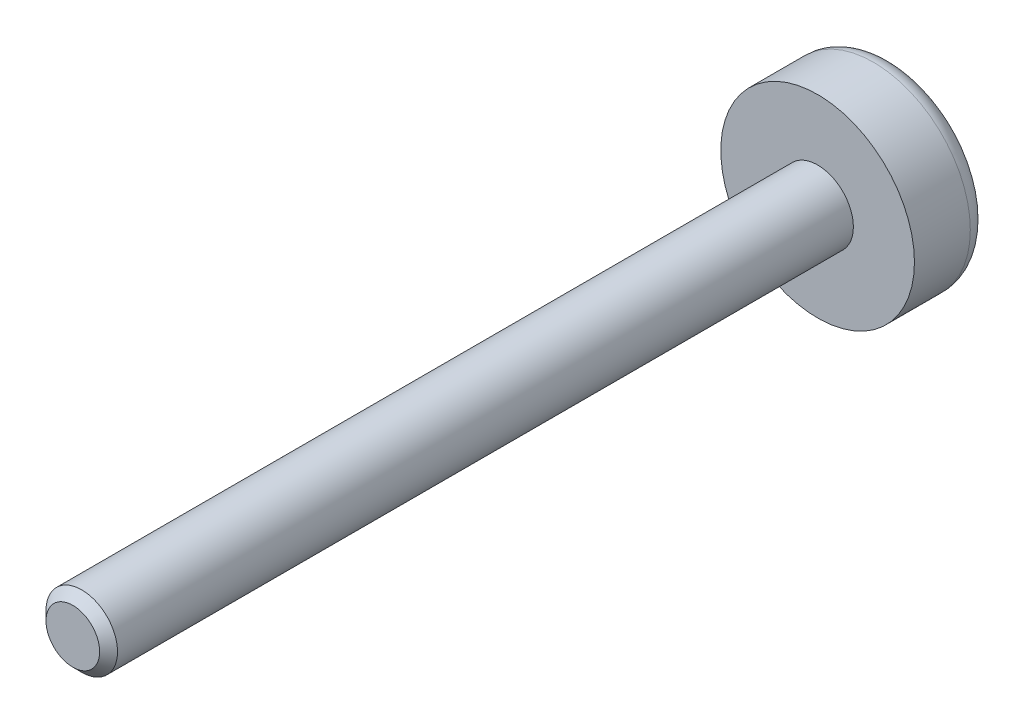
ISO-10303-21;
HEADER;
FILE_DESCRIPTION(('STEP AP214'),'2;1');
FILE_NAME('part.step','',(''),(''),'','','');
FILE_SCHEMA(('AUTOMOTIVE_DESIGN { 1 0 10303 214 1 1 1 1 }'));
ENDSEC;
DATA;
#1=APPLICATION_CONTEXT('core data for automotive mechanical design processes');
#2=APPLICATION_PROTOCOL_DEFINITION('international standard','automotive_design',2000,#1);
#3=PRODUCT_CONTEXT('',#1,'mechanical');
#4=PRODUCT('Part','Part','',(#3));
#5=PRODUCT_RELATED_PRODUCT_CATEGORY('part','',(#4));
#6=PRODUCT_DEFINITION_FORMATION('','',#4);
#7=PRODUCT_DEFINITION_CONTEXT('part definition',#1,'design');
#8=PRODUCT_DEFINITION('design','',#6,#7);
#9=PRODUCT_DEFINITION_SHAPE('','',#8);
#10=(LENGTH_UNIT() NAMED_UNIT(*) SI_UNIT(.MILLI.,.METRE.));
#11=(NAMED_UNIT(*) PLANE_ANGLE_UNIT() SI_UNIT($,.RADIAN.));
#12=(NAMED_UNIT(*) SI_UNIT($,.STERADIAN.) SOLID_ANGLE_UNIT());
#13=UNCERTAINTY_MEASURE_WITH_UNIT(LENGTH_MEASURE(1.E-05),#10,'distance_accuracy_value','');
#14=(GEOMETRIC_REPRESENTATION_CONTEXT(3) GLOBAL_UNCERTAINTY_ASSIGNED_CONTEXT((#13)) GLOBAL_UNIT_ASSIGNED_CONTEXT((#10,
#11,#12)) REPRESENTATION_CONTEXT('',''));
#15=CARTESIAN_POINT('',(0.,0.,0.));
#16=DIRECTION('',(0.,0.,1.));
#17=DIRECTION('',(1.,0.,0.));
#18=AXIS2_PLACEMENT_3D('',#15,#16,#17);
#19=CARTESIAN_POINT('',(0.,0.,25.));
#20=DIRECTION('',(0.,0.,1.));
#21=DIRECTION('',(-1.,0.,0.));
#22=AXIS2_PLACEMENT_3D('',#19,#20,#21);
#23=PLANE('',#22);
#24=CARTESIAN_POINT('',(0.,0.,25.));
#25=DIRECTION('',(0.,0.,-1.));
#26=DIRECTION('',(-1.,0.,0.));
#27=AXIS2_PLACEMENT_3D('',#24,#25,#26);
#28=CIRCLE('',#27,0.900000000000008);
#29=CARTESIAN_POINT('',(-0.900000000000008,0.,25.));
#30=VERTEX_POINT('',#29);
#31=EDGE_CURVE('E140',#30,#30,#28,.T.);
#32=ORIENTED_EDGE('',*,*,#31,.F.);
#33=EDGE_LOOP('',(#32));
#34=FACE_BOUND('',#33,.T.);
#35=ADVANCED_FACE('F41',(#34),#23,.T.);
#36=CARTESIAN_POINT('',(0.,0.,-10.123));
#37=DIRECTION('',(0.,0.,-1.));
#38=DIRECTION('',(1.,0.,0.));
#39=AXIS2_PLACEMENT_3D('',#36,#37,#38);
#40=CYLINDRICAL_SURFACE('',#39,1.2);
#41=CARTESIAN_POINT('',(0.,0.,24.7));
#42=DIRECTION('',(0.,0.,-1.));
#43=DIRECTION('',(-1.,0.,0.));
#44=AXIS2_PLACEMENT_3D('',#41,#42,#43);
#45=CIRCLE('',#44,1.2);
#46=CARTESIAN_POINT('',(-1.2,0.,24.7));
#47=VERTEX_POINT('',#46);
#48=EDGE_CURVE('E137',#47,#47,#45,.F.);
#49=ORIENTED_EDGE('',*,*,#48,.F.);
#50=EDGE_LOOP('',(#49));
#51=FACE_BOUND('',#50,.T.);
#52=CARTESIAN_POINT('',(0.,0.,0.));
#53=DIRECTION('',(0.,0.,1.));
#54=DIRECTION('',(1.,0.,0.));
#55=AXIS2_PLACEMENT_3D('',#52,#53,#54);
#56=CIRCLE('',#55,1.2);
#57=CARTESIAN_POINT('',(1.2,0.,0.));
#58=VERTEX_POINT('',#57);
#59=EDGE_CURVE('E134',#58,#58,#56,.T.);
#60=ORIENTED_EDGE('',*,*,#59,.T.);
#61=EDGE_LOOP('',(#60));
#62=FACE_BOUND('',#61,.T.);
#63=ADVANCED_FACE('F163',(#51,#62),#40,.T.);
#64=CARTESIAN_POINT('',(1.2,0.,0.));
#65=DIRECTION('',(0.,0.,1.));
#66=DIRECTION('',(-1.,0.,0.));
#67=AXIS2_PLACEMENT_3D('',#64,#65,#66);
#68=PLANE('',#67);
#69=ORIENTED_EDGE('',*,*,#59,.F.);
#70=EDGE_LOOP('',(#69));
#71=FACE_BOUND('',#70,.T.);
#72=CARTESIAN_POINT('',(0.,0.,0.));
#73=DIRECTION('',(0.,0.,1.));
#74=DIRECTION('',(1.,0.,0.));
#75=AXIS2_PLACEMENT_3D('',#72,#73,#74);
#76=CIRCLE('',#75,3.25);
#77=CARTESIAN_POINT('',(3.25,0.,0.));
#78=VERTEX_POINT('',#77);
#79=EDGE_CURVE('E131',#78,#78,#76,.T.);
#80=ORIENTED_EDGE('',*,*,#79,.T.);
#81=EDGE_LOOP('',(#80));
#82=FACE_BOUND('',#81,.T.);
#83=ADVANCED_FACE('F157',(#71,#82),#68,.T.);
#84=CARTESIAN_POINT('',(0.,0.,-10.123));
#85=DIRECTION('',(0.,0.,-1.));
#86=DIRECTION('',(1.,0.,0.));
#87=AXIS2_PLACEMENT_3D('',#84,#85,#86);
#88=CYLINDRICAL_SURFACE('',#87,3.25);
#89=CARTESIAN_POINT('',(0.,0.,-1.875));
#90=DIRECTION('',(0.,0.,1.));
#91=DIRECTION('',(1.,0.,0.));
#92=AXIS2_PLACEMENT_3D('',#89,#90,#91);
#93=CIRCLE('',#92,3.25);
#94=CARTESIAN_POINT('',(3.25,0.,-1.875));
#95=VERTEX_POINT('',#94);
#96=EDGE_CURVE('E11',#95,#95,#93,.F.);
#97=ORIENTED_EDGE('',*,*,#96,.F.);
#98=EDGE_LOOP('',(#97));
#99=FACE_BOUND('',#98,.T.);
#100=ORIENTED_EDGE('',*,*,#79,.F.);
#101=EDGE_LOOP('',(#100));
#102=FACE_BOUND('',#101,.T.);
#103=ADVANCED_FACE('F149',(#99,#102),#88,.T.);
#104=CARTESIAN_POINT('',(3.25,0.,-2.5));
#105=DIRECTION('',(0.,0.,-1.));
#106=DIRECTION('',(1.,0.,0.));
#107=AXIS2_PLACEMENT_3D('',#104,#105,#106);
#108=PLANE('',#107);
#109=DIRECTION('',(0.499999999999995,0.866025403784441,0.));
#110=VECTOR('',#109,1.);
#111=CARTESIAN_POINT('',(0.577350269189637,-0.999999999999993,-2.5));
#112=LINE('',#111,#110);
#113=CARTESIAN_POINT('',(0.577350269189637,-0.999999999999993,-2.5));
#114=VERTEX_POINT('',#113);
#115=CARTESIAN_POINT('',(1.15470053837925,0.,-2.5));
#116=VERTEX_POINT('',#115);
#117=EDGE_CURVE('E315',#114,#116,#112,.T.);
#118=ORIENTED_EDGE('',*,*,#117,.T.);
#119=DIRECTION('',(-0.500000000000001,0.866025403784438,0.));
#120=VECTOR('',#119,1.);
#121=CARTESIAN_POINT('',(1.15470053837925,0.,-2.5));
#122=LINE('',#121,#120);
#123=CARTESIAN_POINT('',(0.577350269189624,1.,-2.5));
#124=VERTEX_POINT('',#123);
#125=EDGE_CURVE('E310',#116,#124,#122,.T.);
#126=ORIENTED_EDGE('',*,*,#125,.T.);
#127=DIRECTION('',(-1.,0.,0.));
#128=VECTOR('',#127,1.);
#129=CARTESIAN_POINT('',(0.577350269189624,1.,-2.5));
#130=LINE('',#129,#128);
#131=CARTESIAN_POINT('',(-0.57735026918963,0.999999999999998,-2.5));
#132=VERTEX_POINT('',#131);
#133=EDGE_CURVE('E314',#124,#132,#130,.T.);
#134=ORIENTED_EDGE('',*,*,#133,.T.);
#135=DIRECTION('',(-0.499999999999995,-0.866025403784442,0.));
#136=VECTOR('',#135,1.);
#137=CARTESIAN_POINT('',(-0.57735026918963,0.999999999999998,-2.5));
#138=LINE('',#137,#136);
#139=CARTESIAN_POINT('',(-1.15470053837925,0.,-2.5));
#140=VERTEX_POINT('',#139);
#141=EDGE_CURVE('E322',#132,#140,#138,.T.);
#142=ORIENTED_EDGE('',*,*,#141,.T.);
#143=DIRECTION('',(0.500000000000007,-0.866025403784434,0.));
#144=VECTOR('',#143,1.);
#145=CARTESIAN_POINT('',(-1.15470053837925,0.,-2.5));
#146=LINE('',#145,#144);
#147=CARTESIAN_POINT('',(-0.577350269189617,-1.00000000000001,-2.5));
#148=VERTEX_POINT('',#147);
#149=EDGE_CURVE('E120',#140,#148,#146,.T.);
#150=ORIENTED_EDGE('',*,*,#149,.T.);
#151=DIRECTION('',(1.,0.,0.));
#152=VECTOR('',#151,1.);
#153=CARTESIAN_POINT('',(-0.577350269189617,-1.00000000000001,-2.5));
#154=LINE('',#153,#152);
#155=EDGE_CURVE('E317',#148,#114,#154,.T.);
#156=ORIENTED_EDGE('',*,*,#155,.T.);
#157=EDGE_LOOP('',(#118,#126,#134,#142,#150,#156));
#158=FACE_BOUND('',#157,.T.);
#159=CARTESIAN_POINT('',(0.,0.,-2.5));
#160=DIRECTION('',(0.,0.,1.));
#161=DIRECTION('',(1.,0.,0.));
#162=AXIS2_PLACEMENT_3D('',#159,#160,#161);
#163=CIRCLE('',#162,2.625);
#164=CARTESIAN_POINT('',(2.625,0.,-2.5));
#165=VERTEX_POINT('',#164);
#166=EDGE_CURVE('E49',#165,#165,#163,.T.);
#167=ORIENTED_EDGE('',*,*,#166,.F.);
#168=EDGE_LOOP('',(#167));
#169=FACE_BOUND('',#168,.T.);
#170=ADVANCED_FACE('F146',(#158,#169),#108,.T.);
#171=CARTESIAN_POINT('',(0.,0.,24.7));
#172=DIRECTION('',(0.,0.,-1.));
#173=DIRECTION('',(1.,0.,0.));
#174=AXIS2_PLACEMENT_3D('',#171,#172,#173);
#175=CONICAL_SURFACE('',#174,1.2,0.785398163397443);
#176=ORIENTED_EDGE('',*,*,#31,.T.);
#177=EDGE_LOOP('',(#176));
#178=FACE_BOUND('',#177,.T.);
#179=ORIENTED_EDGE('',*,*,#48,.T.);
#180=EDGE_LOOP('',(#179));
#181=FACE_BOUND('',#180,.T.);
#182=ADVANCED_FACE('F148',(#178,#181),#175,.T.);
#183=CARTESIAN_POINT('',(0.,0.,-1.875));
#184=DIRECTION('',(0.,0.,-1.));
#185=DIRECTION('',(1.,0.,0.));
#186=AXIS2_PLACEMENT_3D('',#183,#184,#185);
#187=TOROIDAL_SURFACE('',#186,2.625,0.625);
#188=ORIENTED_EDGE('',*,*,#96,.T.);
#189=EDGE_LOOP('',(#188));
#190=FACE_BOUND('',#189,.T.);
#191=ORIENTED_EDGE('',*,*,#166,.T.);
#192=EDGE_LOOP('',(#191));
#193=FACE_BOUND('',#192,.T.);
#194=ADVANCED_FACE('F43',(#190,#193),#187,.T.);
#195=CARTESIAN_POINT('',(0.577350269189637,-0.999999999999993,-1.125));
#196=DIRECTION('',(0.866025403784441,-0.499999999999995,0.));
#197=DIRECTION('',(0.499999999999995,0.866025403784441,0.));
#198=AXIS2_PLACEMENT_3D('',#195,#196,#197);
#199=PLANE('',#198);
#200=ORIENTED_EDGE('',*,*,#117,.F.);
#201=DIRECTION('',(0.,0.,-1.));
#202=VECTOR('',#201,1.);
#203=CARTESIAN_POINT('',(0.577350269189637,-0.999999999999993,-1.125));
#204=LINE('',#203,#202);
#205=CARTESIAN_POINT('',(0.577350269189637,-0.999999999999993,-1.125));
#206=VERTEX_POINT('',#205);
#207=EDGE_CURVE('E87',#206,#114,#204,.T.);
#208=ORIENTED_EDGE('',*,*,#207,.F.);
#209=DIRECTION('',(0.499999999999995,0.866025403784441,0.));
#210=VECTOR('',#209,1.);
#211=CARTESIAN_POINT('',(0.577350269189637,-0.999999999999993,-1.125));
#212=LINE('',#211,#210);
#213=CARTESIAN_POINT('',(1.15470053837925,0.,-1.125));
#214=VERTEX_POINT('',#213);
#215=EDGE_CURVE('E325',#206,#214,#212,.T.);
#216=ORIENTED_EDGE('',*,*,#215,.T.);
#217=DIRECTION('',(0.,0.,-1.));
#218=VECTOR('',#217,1.);
#219=CARTESIAN_POINT('',(1.15470053837925,0.,-1.125));
#220=LINE('',#219,#218);
#221=EDGE_CURVE('E56',#214,#116,#220,.T.);
#222=ORIENTED_EDGE('',*,*,#221,.T.);
#223=EDGE_LOOP('',(#200,#208,#216,#222));
#224=FACE_BOUND('',#223,.T.);
#225=ADVANCED_FACE('F210',(#224),#199,.F.);
#226=CARTESIAN_POINT('',(-0.577350269189617,-1.00000000000001,-1.125));
#227=DIRECTION('',(0.,-1.,0.));
#228=DIRECTION('',(1.,0.,0.));
#229=AXIS2_PLACEMENT_3D('',#226,#227,#228);
#230=PLANE('',#229);
#231=ORIENTED_EDGE('',*,*,#155,.F.);
#232=DIRECTION('',(0.,0.,-1.));
#233=VECTOR('',#232,1.);
#234=CARTESIAN_POINT('',(-0.577350269189617,-1.00000000000001,-1.125));
#235=LINE('',#234,#233);
#236=CARTESIAN_POINT('',(-0.577350269189617,-1.00000000000001,-1.125));
#237=VERTEX_POINT('',#236);
#238=EDGE_CURVE('E122',#237,#148,#235,.T.);
#239=ORIENTED_EDGE('',*,*,#238,.F.);
#240=DIRECTION('',(1.,0.,0.));
#241=VECTOR('',#240,1.);
#242=CARTESIAN_POINT('',(-0.577350269189617,-1.00000000000001,-1.125));
#243=LINE('',#242,#241);
#244=EDGE_CURVE('E65',#237,#206,#243,.T.);
#245=ORIENTED_EDGE('',*,*,#244,.T.);
#246=ORIENTED_EDGE('',*,*,#207,.T.);
#247=EDGE_LOOP('',(#231,#239,#245,#246));
#248=FACE_BOUND('',#247,.T.);
#249=ADVANCED_FACE('F220',(#248),#230,.F.);
#250=CARTESIAN_POINT('',(-1.15470053837925,0.,-1.125));
#251=DIRECTION('',(-0.866025403784435,-0.500000000000007,0.));
#252=DIRECTION('',(0.500000000000007,-0.866025403784435,0.));
#253=AXIS2_PLACEMENT_3D('',#250,#251,#252);
#254=PLANE('',#253);
#255=ORIENTED_EDGE('',*,*,#149,.F.);
#256=DIRECTION('',(0.,0.,-1.));
#257=VECTOR('',#256,1.);
#258=CARTESIAN_POINT('',(-1.15470053837925,0.,-1.125));
#259=LINE('',#258,#257);
#260=CARTESIAN_POINT('',(-1.15470053837925,0.,-1.125));
#261=VERTEX_POINT('',#260);
#262=EDGE_CURVE('E109',#261,#140,#259,.T.);
#263=ORIENTED_EDGE('',*,*,#262,.F.);
#264=DIRECTION('',(0.500000000000007,-0.866025403784434,0.));
#265=VECTOR('',#264,1.);
#266=CARTESIAN_POINT('',(-1.15470053837925,0.,-1.125));
#267=LINE('',#266,#265);
#268=EDGE_CURVE('E112',#261,#237,#267,.T.);
#269=ORIENTED_EDGE('',*,*,#268,.T.);
#270=ORIENTED_EDGE('',*,*,#238,.T.);
#271=EDGE_LOOP('',(#255,#263,#269,#270));
#272=FACE_BOUND('',#271,.T.);
#273=ADVANCED_FACE('F118',(#272),#254,.F.);
#274=CARTESIAN_POINT('',(-0.57735026918963,0.999999999999998,-1.125));
#275=DIRECTION('',(-0.866025403784442,0.499999999999995,0.));
#276=DIRECTION('',(-0.499999999999995,-0.866025403784441,0.));
#277=AXIS2_PLACEMENT_3D('',#274,#275,#276);
#278=PLANE('',#277);
#279=ORIENTED_EDGE('',*,*,#141,.F.);
#280=DIRECTION('',(0.,0.,-1.));
#281=VECTOR('',#280,1.);
#282=CARTESIAN_POINT('',(-0.57735026918963,0.999999999999998,-1.125));
#283=LINE('',#282,#281);
#284=CARTESIAN_POINT('',(-0.57735026918963,0.999999999999998,-1.125));
#285=VERTEX_POINT('',#284);
#286=EDGE_CURVE('E111',#285,#132,#283,.T.);
#287=ORIENTED_EDGE('',*,*,#286,.F.);
#288=DIRECTION('',(-0.499999999999995,-0.866025403784442,0.));
#289=VECTOR('',#288,1.);
#290=CARTESIAN_POINT('',(-0.57735026918963,0.999999999999998,-1.125));
#291=LINE('',#290,#289);
#292=EDGE_CURVE('E104',#285,#261,#291,.T.);
#293=ORIENTED_EDGE('',*,*,#292,.T.);
#294=ORIENTED_EDGE('',*,*,#262,.T.);
#295=EDGE_LOOP('',(#279,#287,#293,#294));
#296=FACE_BOUND('',#295,.T.);
#297=ADVANCED_FACE('F107',(#296),#278,.F.);
#298=CARTESIAN_POINT('',(0.577350269189624,1.,-1.125));
#299=DIRECTION('',(0.,1.,0.));
#300=DIRECTION('',(-1.,0.,0.));
#301=AXIS2_PLACEMENT_3D('',#298,#299,#300);
#302=PLANE('',#301);
#303=ORIENTED_EDGE('',*,*,#133,.F.);
#304=DIRECTION('',(0.,0.,-1.));
#305=VECTOR('',#304,1.);
#306=CARTESIAN_POINT('',(0.577350269189624,1.,-1.125));
#307=LINE('',#306,#305);
#308=CARTESIAN_POINT('',(0.577350269189624,1.,-1.125));
#309=VERTEX_POINT('',#308);
#310=EDGE_CURVE('E125',#309,#124,#307,.T.);
#311=ORIENTED_EDGE('',*,*,#310,.F.);
#312=DIRECTION('',(-1.,0.,0.));
#313=VECTOR('',#312,1.);
#314=CARTESIAN_POINT('',(0.577350269189624,1.,-1.125));
#315=LINE('',#314,#313);
#316=EDGE_CURVE('E113',#309,#285,#315,.T.);
#317=ORIENTED_EDGE('',*,*,#316,.T.);
#318=ORIENTED_EDGE('',*,*,#286,.T.);
#319=EDGE_LOOP('',(#303,#311,#317,#318));
#320=FACE_BOUND('',#319,.T.);
#321=ADVANCED_FACE('F247',(#320),#302,.F.);
#322=CARTESIAN_POINT('',(1.15470053837925,0.,-1.125));
#323=DIRECTION('',(0.866025403784438,0.500000000000001,0.));
#324=DIRECTION('',(-0.500000000000001,0.866025403784438,0.));
#325=AXIS2_PLACEMENT_3D('',#322,#323,#324);
#326=PLANE('',#325);
#327=ORIENTED_EDGE('',*,*,#125,.F.);
#328=ORIENTED_EDGE('',*,*,#221,.F.);
#329=DIRECTION('',(-0.500000000000001,0.866025403784438,0.));
#330=VECTOR('',#329,1.);
#331=CARTESIAN_POINT('',(1.15470053837925,0.,-1.125));
#332=LINE('',#331,#330);
#333=EDGE_CURVE('E95',#214,#309,#332,.T.);
#334=ORIENTED_EDGE('',*,*,#333,.T.);
#335=ORIENTED_EDGE('',*,*,#310,.T.);
#336=EDGE_LOOP('',(#327,#328,#334,#335));
#337=FACE_BOUND('',#336,.T.);
#338=ADVANCED_FACE('F257',(#337),#326,.F.);
#339=CARTESIAN_POINT('',(0.,0.,-1.125));
#340=DIRECTION('',(0.,0.,-1.));
#341=DIRECTION('',(1.,0.,0.));
#342=AXIS2_PLACEMENT_3D('',#339,#340,#341);
#343=PLANE('',#342);
#344=ORIENTED_EDGE('',*,*,#215,.F.);
#345=ORIENTED_EDGE('',*,*,#244,.F.);
#346=ORIENTED_EDGE('',*,*,#268,.F.);
#347=ORIENTED_EDGE('',*,*,#292,.F.);
#348=ORIENTED_EDGE('',*,*,#316,.F.);
#349=ORIENTED_EDGE('',*,*,#333,.F.);
#350=EDGE_LOOP('',(#344,#345,#346,#347,#348,#349));
#351=FACE_BOUND('',#350,.T.);
#352=ADVANCED_FACE('F115',(#351),#343,.T.);
#353=CLOSED_SHELL('',(#35,#63,#83,#103,#170,#182,#194,#225,#249,#273,#297,#321,#338,#352));
#354=MANIFOLD_SOLID_BREP('B2',#353);
#355=ADVANCED_BREP_SHAPE_REPRESENTATION('',(#18,#354),#14);
#356=SHAPE_DEFINITION_REPRESENTATION(#9,#355);
ENDSEC;
END-ISO-10303-21;
